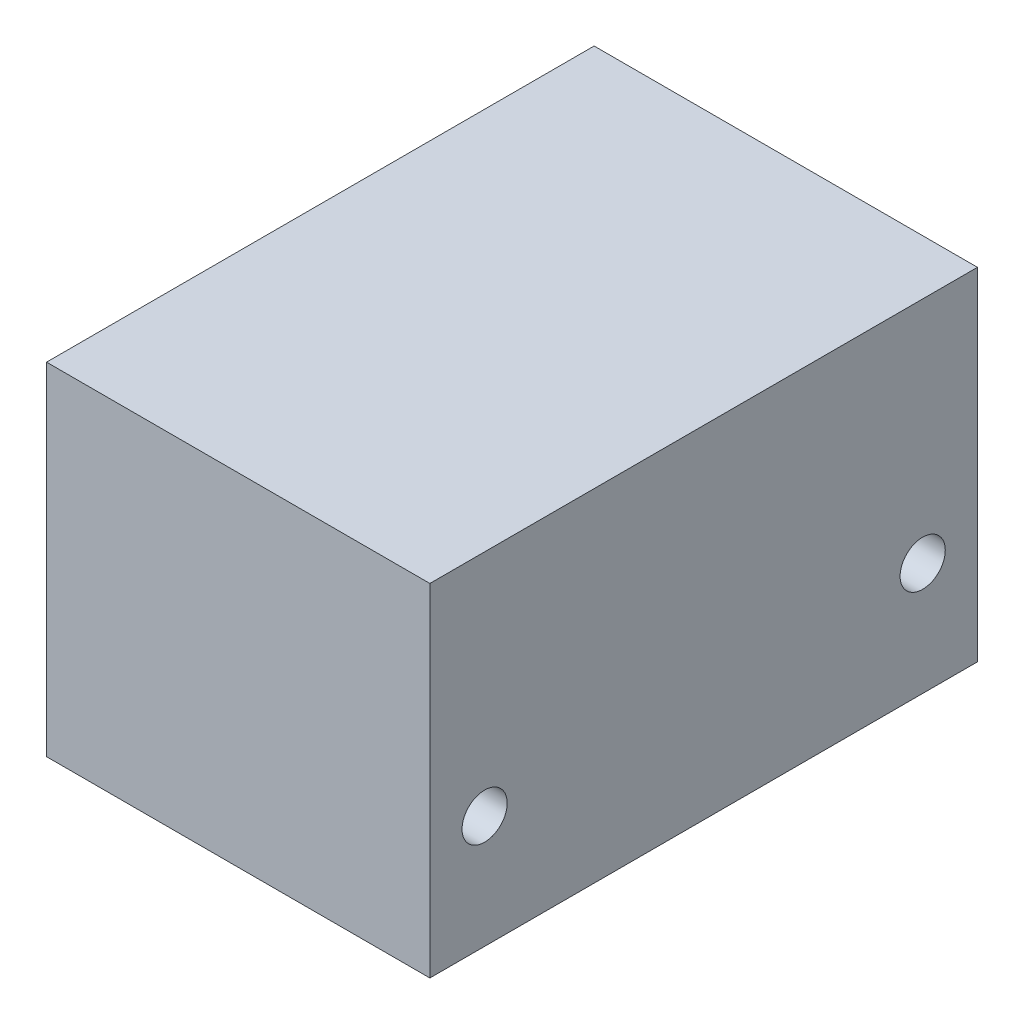
ISO-10303-21;
HEADER;
FILE_DESCRIPTION(('STEP AP214'),'2;1');
FILE_NAME('part.step','',(''),(''),'','','');
FILE_SCHEMA(('AUTOMOTIVE_DESIGN { 1 0 10303 214 1 1 1 1 }'));
ENDSEC;
DATA;
#1=APPLICATION_CONTEXT('core data for automotive mechanical design processes');
#2=APPLICATION_PROTOCOL_DEFINITION('international standard','automotive_design',2000,#1);
#3=PRODUCT_CONTEXT('',#1,'mechanical');
#4=PRODUCT('Part','Part','',(#3));
#5=PRODUCT_RELATED_PRODUCT_CATEGORY('part','',(#4));
#6=PRODUCT_DEFINITION_FORMATION('','',#4);
#7=PRODUCT_DEFINITION_CONTEXT('part definition',#1,'design');
#8=PRODUCT_DEFINITION('design','',#6,#7);
#9=PRODUCT_DEFINITION_SHAPE('','',#8);
#10=(LENGTH_UNIT() NAMED_UNIT(*) SI_UNIT(.MILLI.,.METRE.));
#11=(NAMED_UNIT(*) PLANE_ANGLE_UNIT() SI_UNIT($,.RADIAN.));
#12=(NAMED_UNIT(*) SI_UNIT($,.STERADIAN.) SOLID_ANGLE_UNIT());
#13=UNCERTAINTY_MEASURE_WITH_UNIT(LENGTH_MEASURE(1.E-05),#10,'distance_accuracy_value','');
#14=(GEOMETRIC_REPRESENTATION_CONTEXT(3) GLOBAL_UNCERTAINTY_ASSIGNED_CONTEXT((#13)) GLOBAL_UNIT_ASSIGNED_CONTEXT((#10,
#11,#12)) REPRESENTATION_CONTEXT('',''));
#15=CARTESIAN_POINT('',(0.,0.,0.));
#16=DIRECTION('',(0.,0.,1.));
#17=DIRECTION('',(1.,0.,0.));
#18=AXIS2_PLACEMENT_3D('',#15,#16,#17);
#19=CARTESIAN_POINT('',(-7.,13.98,10.));
#20=DIRECTION('',(1.,0.,0.));
#21=DIRECTION('',(0.,0.,-1.));
#22=AXIS2_PLACEMENT_3D('',#19,#20,#21);
#23=PLANE('',#22);
#24=CARTESIAN_POINT('',(-7.,5.62,8.));
#25=DIRECTION('',(1.,0.,0.));
#26=DIRECTION('',(0.,0.,-1.));
#27=AXIS2_PLACEMENT_3D('',#24,#25,#26);
#28=CIRCLE('',#27,0.825);
#29=CARTESIAN_POINT('',(-7.,5.62,7.175));
#30=VERTEX_POINT('',#29);
#31=EDGE_CURVE('E113',#30,#30,#28,.T.);
#32=ORIENTED_EDGE('',*,*,#31,.T.);
#33=EDGE_LOOP('',(#32));
#34=FACE_BOUND('',#33,.T.);
#35=CARTESIAN_POINT('',(-7.,5.62000000000001,-8.));
#36=DIRECTION('',(1.,0.,0.));
#37=DIRECTION('',(0.,0.,-1.));
#38=AXIS2_PLACEMENT_3D('',#35,#36,#37);
#39=CIRCLE('',#38,0.825);
#40=CARTESIAN_POINT('',(-7.,5.62000000000001,-8.825));
#41=VERTEX_POINT('',#40);
#42=EDGE_CURVE('E111',#41,#41,#39,.T.);
#43=ORIENTED_EDGE('',*,*,#42,.T.);
#44=EDGE_LOOP('',(#43));
#45=FACE_BOUND('',#44,.T.);
#46=DIRECTION('',(0.,0.,-1.));
#47=VECTOR('',#46,1.);
#48=CARTESIAN_POINT('',(-7.,1.5,10.));
#49=LINE('',#48,#47);
#50=CARTESIAN_POINT('',(-7.,1.5,10.));
#51=VERTEX_POINT('',#50);
#52=CARTESIAN_POINT('',(-7.,1.5,-10.));
#53=VERTEX_POINT('',#52);
#54=EDGE_CURVE('E56',#51,#53,#49,.T.);
#55=ORIENTED_EDGE('',*,*,#54,.F.);
#56=DIRECTION('',(0.,-1.,0.));
#57=VECTOR('',#56,1.);
#58=CARTESIAN_POINT('',(-7.,13.98,10.));
#59=LINE('',#58,#57);
#60=CARTESIAN_POINT('',(-7.,13.98,10.));
#61=VERTEX_POINT('',#60);
#62=EDGE_CURVE('E50',#61,#51,#59,.T.);
#63=ORIENTED_EDGE('',*,*,#62,.F.);
#64=DIRECTION('',(0.,0.,1.));
#65=VECTOR('',#64,1.);
#66=CARTESIAN_POINT('',(-7.,13.98,10.));
#67=LINE('',#66,#65);
#68=CARTESIAN_POINT('',(-7.,13.98,-10.));
#69=VERTEX_POINT('',#68);
#70=EDGE_CURVE('E115',#69,#61,#67,.T.);
#71=ORIENTED_EDGE('',*,*,#70,.F.);
#72=DIRECTION('',(0.,-1.,0.));
#73=VECTOR('',#72,1.);
#74=CARTESIAN_POINT('',(-7.,13.98,-10.));
#75=LINE('',#74,#73);
#76=EDGE_CURVE('E103',#69,#53,#75,.T.);
#77=ORIENTED_EDGE('',*,*,#76,.T.);
#78=EDGE_LOOP('',(#55,#63,#71,#77));
#79=FACE_BOUND('',#78,.T.);
#80=ADVANCED_FACE('F42',(#34,#45,#79),#23,.F.);
#81=CARTESIAN_POINT('',(7.,13.98,10.));
#82=DIRECTION('',(0.,0.,-1.));
#83=DIRECTION('',(-1.,0.,0.));
#84=AXIS2_PLACEMENT_3D('',#81,#82,#83);
#85=PLANE('',#84);
#86=DIRECTION('',(-1.,0.,0.));
#87=VECTOR('',#86,1.);
#88=CARTESIAN_POINT('',(-7.,1.5,10.));
#89=LINE('',#88,#87);
#90=CARTESIAN_POINT('',(7.,1.5,10.));
#91=VERTEX_POINT('',#90);
#92=EDGE_CURVE('E99',#91,#51,#89,.T.);
#93=ORIENTED_EDGE('',*,*,#92,.F.);
#94=DIRECTION('',(0.,-1.,0.));
#95=VECTOR('',#94,1.);
#96=CARTESIAN_POINT('',(7.,13.98,10.));
#97=LINE('',#96,#95);
#98=CARTESIAN_POINT('',(7.,13.98,10.));
#99=VERTEX_POINT('',#98);
#100=EDGE_CURVE('E97',#99,#91,#97,.T.);
#101=ORIENTED_EDGE('',*,*,#100,.F.);
#102=DIRECTION('',(1.,0.,0.));
#103=VECTOR('',#102,1.);
#104=CARTESIAN_POINT('',(7.,13.98,10.));
#105=LINE('',#104,#103);
#106=EDGE_CURVE('E109',#61,#99,#105,.T.);
#107=ORIENTED_EDGE('',*,*,#106,.F.);
#108=ORIENTED_EDGE('',*,*,#62,.T.);
#109=EDGE_LOOP('',(#93,#101,#107,#108));
#110=FACE_BOUND('',#109,.T.);
#111=ADVANCED_FACE('F151',(#110),#85,.F.);
#112=CARTESIAN_POINT('',(7.,13.98,10.));
#113=DIRECTION('',(-1.,0.,0.));
#114=DIRECTION('',(0.,0.,1.));
#115=AXIS2_PLACEMENT_3D('',#112,#113,#114);
#116=PLANE('',#115);
#117=CARTESIAN_POINT('',(7.,5.62,8.));
#118=DIRECTION('',(1.,0.,0.));
#119=DIRECTION('',(0.,0.,-1.));
#120=AXIS2_PLACEMENT_3D('',#117,#118,#119);
#121=CIRCLE('',#120,0.825);
#122=CARTESIAN_POINT('',(7.,5.62,7.175));
#123=VERTEX_POINT('',#122);
#124=EDGE_CURVE('E119',#123,#123,#121,.T.);
#125=ORIENTED_EDGE('',*,*,#124,.F.);
#126=EDGE_LOOP('',(#125));
#127=FACE_BOUND('',#126,.T.);
#128=CARTESIAN_POINT('',(7.,5.62000000000001,-8.));
#129=DIRECTION('',(1.,0.,0.));
#130=DIRECTION('',(0.,0.,-1.));
#131=AXIS2_PLACEMENT_3D('',#128,#129,#130);
#132=CIRCLE('',#131,0.825);
#133=CARTESIAN_POINT('',(7.,5.62000000000001,-8.825));
#134=VERTEX_POINT('',#133);
#135=EDGE_CURVE('E121',#134,#134,#132,.T.);
#136=ORIENTED_EDGE('',*,*,#135,.F.);
#137=EDGE_LOOP('',(#136));
#138=FACE_BOUND('',#137,.T.);
#139=DIRECTION('',(0.,0.,1.));
#140=VECTOR('',#139,1.);
#141=CARTESIAN_POINT('',(7.,1.5,10.));
#142=LINE('',#141,#140);
#143=CARTESIAN_POINT('',(7.,1.5,-10.));
#144=VERTEX_POINT('',#143);
#145=EDGE_CURVE('E88',#144,#91,#142,.T.);
#146=ORIENTED_EDGE('',*,*,#145,.F.);
#147=DIRECTION('',(0.,-1.,0.));
#148=VECTOR('',#147,1.);
#149=CARTESIAN_POINT('',(7.,13.98,-10.));
#150=LINE('',#149,#148);
#151=CARTESIAN_POINT('',(7.,13.98,-10.));
#152=VERTEX_POINT('',#151);
#153=EDGE_CURVE('E100',#152,#144,#150,.T.);
#154=ORIENTED_EDGE('',*,*,#153,.F.);
#155=DIRECTION('',(0.,0.,-1.));
#156=VECTOR('',#155,1.);
#157=CARTESIAN_POINT('',(7.,13.98,10.));
#158=LINE('',#157,#156);
#159=EDGE_CURVE('E107',#99,#152,#158,.T.);
#160=ORIENTED_EDGE('',*,*,#159,.F.);
#161=ORIENTED_EDGE('',*,*,#100,.T.);
#162=EDGE_LOOP('',(#146,#154,#160,#161));
#163=FACE_BOUND('',#162,.T.);
#164=ADVANCED_FACE('F92',(#127,#138,#163),#116,.F.);
#165=CARTESIAN_POINT('',(7.,13.98,-10.));
#166=DIRECTION('',(0.,0.,1.));
#167=DIRECTION('',(1.,0.,0.));
#168=AXIS2_PLACEMENT_3D('',#165,#166,#167);
#169=PLANE('',#168);
#170=DIRECTION('',(1.,0.,0.));
#171=VECTOR('',#170,1.);
#172=CARTESIAN_POINT('',(-7.,1.5,-10.));
#173=LINE('',#172,#171);
#174=EDGE_CURVE('E84',#53,#144,#173,.T.);
#175=ORIENTED_EDGE('',*,*,#174,.F.);
#176=ORIENTED_EDGE('',*,*,#76,.F.);
#177=DIRECTION('',(-1.,0.,0.));
#178=VECTOR('',#177,1.);
#179=CARTESIAN_POINT('',(7.,13.98,-10.));
#180=LINE('',#179,#178);
#181=EDGE_CURVE('E67',#152,#69,#180,.T.);
#182=ORIENTED_EDGE('',*,*,#181,.F.);
#183=ORIENTED_EDGE('',*,*,#153,.T.);
#184=EDGE_LOOP('',(#175,#176,#182,#183));
#185=FACE_BOUND('',#184,.T.);
#186=ADVANCED_FACE('F105',(#185),#169,.F.);
#187=CARTESIAN_POINT('',(0.,13.98,0.));
#188=DIRECTION('',(0.,1.,0.));
#189=DIRECTION('',(0.,0.,1.));
#190=AXIS2_PLACEMENT_3D('',#187,#188,#189);
#191=PLANE('',#190);
#192=ORIENTED_EDGE('',*,*,#70,.T.);
#193=ORIENTED_EDGE('',*,*,#106,.T.);
#194=ORIENTED_EDGE('',*,*,#159,.T.);
#195=ORIENTED_EDGE('',*,*,#181,.T.);
#196=EDGE_LOOP('',(#192,#193,#194,#195));
#197=FACE_BOUND('',#196,.T.);
#198=ADVANCED_FACE('F163',(#197),#191,.T.);
#199=CARTESIAN_POINT('',(-7.,5.62,8.));
#200=DIRECTION('',(1.,0.,0.));
#201=DIRECTION('',(0.,0.,-1.));
#202=AXIS2_PLACEMENT_3D('',#199,#200,#201);
#203=CYLINDRICAL_SURFACE('',#202,0.825);
#204=CARTESIAN_POINT('',(-7.,5.62,7.175));
#205=CARTESIAN_POINT('',(-6.85416666666667,5.62,7.175));
#206=CARTESIAN_POINT('',(-6.70833333333333,5.62,7.175));
#207=CARTESIAN_POINT('',(-6.41666666666667,5.62,7.175));
#208=CARTESIAN_POINT('',(-6.27083333333333,5.62,7.175));
#209=CARTESIAN_POINT('',(-5.97916666666667,5.62,7.175));
#210=CARTESIAN_POINT('',(-5.83333333333334,5.62,7.175));
#211=CARTESIAN_POINT('',(-5.54166666666667,5.62,7.175));
#212=CARTESIAN_POINT('',(-5.39583333333333,5.62,7.175));
#213=CARTESIAN_POINT('',(-5.10416666666667,5.62,7.175));
#214=CARTESIAN_POINT('',(-4.95833333333334,5.62,7.175));
#215=CARTESIAN_POINT('',(-4.66666666666667,5.62,7.175));
#216=CARTESIAN_POINT('',(-4.52083333333334,5.62,7.175));
#217=CARTESIAN_POINT('',(-4.22916666666667,5.62,7.175));
#218=CARTESIAN_POINT('',(-4.08333333333334,5.62,7.175));
#219=CARTESIAN_POINT('',(-3.79166666666667,5.62,7.175));
#220=CARTESIAN_POINT('',(-3.64583333333334,5.62,7.175));
#221=CARTESIAN_POINT('',(-3.35416666666667,5.62,7.175));
#222=CARTESIAN_POINT('',(-3.20833333333334,5.62,7.175));
#223=CARTESIAN_POINT('',(-2.91666666666667,5.62,7.175));
#224=CARTESIAN_POINT('',(-2.77083333333334,5.62,7.175));
#225=CARTESIAN_POINT('',(-2.47916666666667,5.62,7.175));
#226=CARTESIAN_POINT('',(-2.33333333333334,5.62,7.175));
#227=CARTESIAN_POINT('',(-2.04166666666667,5.62,7.175));
#228=CARTESIAN_POINT('',(-1.89583333333334,5.62,7.175));
#229=CARTESIAN_POINT('',(-1.60416666666667,5.62,7.175));
#230=CARTESIAN_POINT('',(-1.45833333333334,5.62,7.175));
#231=CARTESIAN_POINT('',(-1.16666666666667,5.62,7.175));
#232=CARTESIAN_POINT('',(-1.02083333333334,5.62,7.175));
#233=CARTESIAN_POINT('',(-0.729166666666669,5.62,7.175));
#234=CARTESIAN_POINT('',(-0.583333333333336,5.62,7.175));
#235=CARTESIAN_POINT('',(-0.29166666666667,5.62,7.175));
#236=CARTESIAN_POINT('',(-0.145833333333336,5.62,7.175));
#237=CARTESIAN_POINT('',(0.145833333333331,5.62,7.175));
#238=CARTESIAN_POINT('',(0.291666666666664,5.62,7.175));
#239=CARTESIAN_POINT('',(0.583333333333331,5.62,7.175));
#240=CARTESIAN_POINT('',(0.729166666666664,5.62,7.175));
#241=CARTESIAN_POINT('',(1.02083333333333,5.62,7.175));
#242=CARTESIAN_POINT('',(1.16666666666666,5.62,7.175));
#243=CARTESIAN_POINT('',(1.45833333333333,5.62,7.175));
#244=CARTESIAN_POINT('',(1.60416666666666,5.62,7.175));
#245=CARTESIAN_POINT('',(1.89583333333333,5.62,7.175));
#246=CARTESIAN_POINT('',(2.04166666666666,5.62,7.175));
#247=CARTESIAN_POINT('',(2.33333333333333,5.62,7.175));
#248=CARTESIAN_POINT('',(2.47916666666666,5.62,7.175));
#249=CARTESIAN_POINT('',(2.77083333333333,5.62,7.175));
#250=CARTESIAN_POINT('',(2.91666666666666,5.62,7.175));
#251=CARTESIAN_POINT('',(3.20833333333333,5.62,7.175));
#252=CARTESIAN_POINT('',(3.35416666666666,5.62,7.175));
#253=CARTESIAN_POINT('',(3.64583333333333,5.62,7.175));
#254=CARTESIAN_POINT('',(3.79166666666666,5.62,7.175));
#255=CARTESIAN_POINT('',(4.08333333333333,5.62,7.175));
#256=CARTESIAN_POINT('',(4.22916666666666,5.62,7.175));
#257=CARTESIAN_POINT('',(4.52083333333333,5.62,7.175));
#258=CARTESIAN_POINT('',(4.66666666666666,5.62,7.175));
#259=CARTESIAN_POINT('',(4.95833333333333,5.62,7.175));
#260=CARTESIAN_POINT('',(5.10416666666666,5.62,7.175));
#261=CARTESIAN_POINT('',(5.39583333333333,5.62,7.175));
#262=CARTESIAN_POINT('',(5.54166666666666,5.62,7.175));
#263=CARTESIAN_POINT('',(5.83333333333333,5.62,7.175));
#264=CARTESIAN_POINT('',(5.97916666666666,5.62,7.175));
#265=CARTESIAN_POINT('',(6.27083333333333,5.62,7.175));
#266=CARTESIAN_POINT('',(6.41666666666666,5.62,7.175));
#267=CARTESIAN_POINT('',(6.70833333333333,5.62,7.175));
#268=CARTESIAN_POINT('',(6.85416666666666,5.62,7.175));
#269=CARTESIAN_POINT('',(7.,5.62,7.175));
#270=B_SPLINE_CURVE_WITH_KNOTS('',3,(#204,#205,#206,#207,#208,#209,#210,#211,#212,#213,#214,
#215,#216,#217,#218,#219,#220,#221,#222,#223,#224,#225,#226,#227,#228,#229,#230,#231,#232,#233,
#234,#235,#236,#237,#238,#239,#240,#241,#242,#243,#244,#245,#246,#247,#248,#249,#250,#251,#252,
#253,#254,#255,#256,#257,#258,#259,#260,#261,#262,#263,#264,#265,#266,#267,#268,#269),
.UNSPECIFIED.,.F.,.F.,(4,2,2,2,2,2,2,2,2,2,2,2,2,2,2,2,2,2,2,2,2,2,2,2,2,2,2,2,2,2,2,2,4),(0.,
0.4375,0.874999999999999,1.3125,1.75,2.1875,2.625,3.0625,3.5,3.9375,4.375,4.8125,5.25,5.6875,
6.125,6.5625,7.,7.4375,7.875,8.3125,8.75,9.1875,9.625,10.0625,10.5,10.9375,11.375,11.8125,12.25,
12.6875,13.125,13.5625,14.),.UNSPECIFIED.);
#271=EDGE_CURVE('BSEAM150',#30,#123,#270,.T.);
#272=ORIENTED_EDGE('',*,*,#31,.F.);
#273=ORIENTED_EDGE('',*,*,#124,.T.);
#274=ORIENTED_EDGE('',*,*,#271,.T.);
#275=ORIENTED_EDGE('',*,*,#271,.F.);
#276=EDGE_LOOP('',(#272,#274,#273,#275));
#277=FACE_BOUND('',#276,.T.);
#278=ADVANCED_FACE('F150',(#277),#203,.F.);
#279=CARTESIAN_POINT('',(-7.,5.62000000000001,-8.));
#280=DIRECTION('',(1.,0.,0.));
#281=DIRECTION('',(0.,0.,-1.));
#282=AXIS2_PLACEMENT_3D('',#279,#280,#281);
#283=CYLINDRICAL_SURFACE('',#282,0.825);
#284=CARTESIAN_POINT('',(-7.,5.62000000000001,-8.825));
#285=CARTESIAN_POINT('',(-6.85416666666667,5.62000000000001,-8.825));
#286=CARTESIAN_POINT('',(-6.70833333333333,5.62000000000001,-8.825));
#287=CARTESIAN_POINT('',(-6.41666666666667,5.62000000000001,-8.825));
#288=CARTESIAN_POINT('',(-6.27083333333333,5.62000000000001,-8.825));
#289=CARTESIAN_POINT('',(-5.97916666666667,5.62000000000001,-8.825));
#290=CARTESIAN_POINT('',(-5.83333333333334,5.62000000000001,-8.825));
#291=CARTESIAN_POINT('',(-5.54166666666667,5.62000000000001,-8.825));
#292=CARTESIAN_POINT('',(-5.39583333333333,5.62000000000001,-8.825));
#293=CARTESIAN_POINT('',(-5.10416666666667,5.62000000000001,-8.825));
#294=CARTESIAN_POINT('',(-4.95833333333334,5.62000000000001,-8.825));
#295=CARTESIAN_POINT('',(-4.66666666666667,5.62000000000001,-8.825));
#296=CARTESIAN_POINT('',(-4.52083333333334,5.62000000000001,-8.825));
#297=CARTESIAN_POINT('',(-4.22916666666667,5.62000000000001,-8.825));
#298=CARTESIAN_POINT('',(-4.08333333333334,5.62000000000001,-8.825));
#299=CARTESIAN_POINT('',(-3.79166666666667,5.62000000000001,-8.825));
#300=CARTESIAN_POINT('',(-3.64583333333334,5.62000000000001,-8.825));
#301=CARTESIAN_POINT('',(-3.35416666666667,5.62000000000001,-8.825));
#302=CARTESIAN_POINT('',(-3.20833333333334,5.62000000000001,-8.825));
#303=CARTESIAN_POINT('',(-2.91666666666667,5.62000000000001,-8.825));
#304=CARTESIAN_POINT('',(-2.77083333333334,5.62000000000001,-8.825));
#305=CARTESIAN_POINT('',(-2.47916666666667,5.62000000000001,-8.825));
#306=CARTESIAN_POINT('',(-2.33333333333334,5.62000000000001,-8.825));
#307=CARTESIAN_POINT('',(-2.04166666666667,5.62000000000001,-8.825));
#308=CARTESIAN_POINT('',(-1.89583333333334,5.62000000000001,-8.825));
#309=CARTESIAN_POINT('',(-1.60416666666667,5.62000000000001,-8.825));
#310=CARTESIAN_POINT('',(-1.45833333333334,5.62000000000001,-8.825));
#311=CARTESIAN_POINT('',(-1.16666666666667,5.62000000000001,-8.825));
#312=CARTESIAN_POINT('',(-1.02083333333334,5.62000000000001,-8.825));
#313=CARTESIAN_POINT('',(-0.729166666666669,5.62000000000001,-8.825));
#314=CARTESIAN_POINT('',(-0.583333333333336,5.62000000000001,-8.825));
#315=CARTESIAN_POINT('',(-0.29166666666667,5.62000000000001,-8.825));
#316=CARTESIAN_POINT('',(-0.145833333333336,5.62000000000001,-8.825));
#317=CARTESIAN_POINT('',(0.145833333333331,5.62000000000001,-8.825));
#318=CARTESIAN_POINT('',(0.291666666666664,5.62000000000001,-8.825));
#319=CARTESIAN_POINT('',(0.583333333333331,5.62000000000001,-8.825));
#320=CARTESIAN_POINT('',(0.729166666666664,5.62000000000001,-8.825));
#321=CARTESIAN_POINT('',(1.02083333333333,5.62000000000001,-8.825));
#322=CARTESIAN_POINT('',(1.16666666666666,5.62000000000001,-8.825));
#323=CARTESIAN_POINT('',(1.45833333333333,5.62000000000001,-8.825));
#324=CARTESIAN_POINT('',(1.60416666666666,5.62000000000001,-8.825));
#325=CARTESIAN_POINT('',(1.89583333333333,5.62000000000001,-8.825));
#326=CARTESIAN_POINT('',(2.04166666666666,5.62000000000001,-8.825));
#327=CARTESIAN_POINT('',(2.33333333333333,5.62000000000001,-8.825));
#328=CARTESIAN_POINT('',(2.47916666666666,5.62000000000001,-8.825));
#329=CARTESIAN_POINT('',(2.77083333333333,5.62000000000001,-8.825));
#330=CARTESIAN_POINT('',(2.91666666666666,5.62000000000001,-8.825));
#331=CARTESIAN_POINT('',(3.20833333333333,5.62000000000001,-8.825));
#332=CARTESIAN_POINT('',(3.35416666666666,5.62000000000001,-8.825));
#333=CARTESIAN_POINT('',(3.64583333333333,5.62000000000001,-8.825));
#334=CARTESIAN_POINT('',(3.79166666666666,5.62000000000001,-8.825));
#335=CARTESIAN_POINT('',(4.08333333333333,5.62000000000001,-8.825));
#336=CARTESIAN_POINT('',(4.22916666666666,5.62000000000001,-8.825));
#337=CARTESIAN_POINT('',(4.52083333333333,5.62000000000001,-8.825));
#338=CARTESIAN_POINT('',(4.66666666666666,5.62000000000001,-8.825));
#339=CARTESIAN_POINT('',(4.95833333333333,5.62000000000001,-8.825));
#340=CARTESIAN_POINT('',(5.10416666666666,5.62000000000001,-8.825));
#341=CARTESIAN_POINT('',(5.39583333333333,5.62000000000001,-8.825));
#342=CARTESIAN_POINT('',(5.54166666666666,5.62000000000001,-8.825));
#343=CARTESIAN_POINT('',(5.83333333333333,5.62000000000001,-8.825));
#344=CARTESIAN_POINT('',(5.97916666666666,5.62000000000001,-8.825));
#345=CARTESIAN_POINT('',(6.27083333333333,5.62000000000001,-8.825));
#346=CARTESIAN_POINT('',(6.41666666666666,5.62000000000001,-8.825));
#347=CARTESIAN_POINT('',(6.70833333333333,5.62000000000001,-8.825));
#348=CARTESIAN_POINT('',(6.85416666666666,5.62000000000001,-8.825));
#349=CARTESIAN_POINT('',(7.,5.62000000000001,-8.825));
#350=B_SPLINE_CURVE_WITH_KNOTS('',3,(#284,#285,#286,#287,#288,#289,#290,#291,#292,#293,#294,
#295,#296,#297,#298,#299,#300,#301,#302,#303,#304,#305,#306,#307,#308,#309,#310,#311,#312,#313,
#314,#315,#316,#317,#318,#319,#320,#321,#322,#323,#324,#325,#326,#327,#328,#329,#330,#331,#332,
#333,#334,#335,#336,#337,#338,#339,#340,#341,#342,#343,#344,#345,#346,#347,#348,#349),
.UNSPECIFIED.,.F.,.F.,(4,2,2,2,2,2,2,2,2,2,2,2,2,2,2,2,2,2,2,2,2,2,2,2,2,2,2,2,2,2,2,2,4),(0.,
0.4375,0.874999999999999,1.3125,1.75,2.1875,2.625,3.0625,3.5,3.9375,4.375,4.8125,5.25,5.6875,
6.125,6.5625,7.,7.4375,7.875,8.3125,8.75,9.1875,9.625,10.0625,10.5,10.9375,11.375,11.8125,12.25,
12.6875,13.125,13.5625,14.),.UNSPECIFIED.);
#351=EDGE_CURVE('BSEAM143',#41,#134,#350,.T.);
#352=ORIENTED_EDGE('',*,*,#42,.F.);
#353=ORIENTED_EDGE('',*,*,#135,.T.);
#354=ORIENTED_EDGE('',*,*,#351,.T.);
#355=ORIENTED_EDGE('',*,*,#351,.F.);
#356=EDGE_LOOP('',(#352,#354,#353,#355));
#357=FACE_BOUND('',#356,.T.);
#358=ADVANCED_FACE('F143',(#357),#283,.F.);
#359=CARTESIAN_POINT('',(0.,1.5,0.));
#360=DIRECTION('',(0.,-1.,0.));
#361=DIRECTION('',(0.,0.,-1.));
#362=AXIS2_PLACEMENT_3D('',#359,#360,#361);
#363=PLANE('',#362);
#364=CARTESIAN_POINT('',(0.,1.5,0.));
#365=DIRECTION('',(0.,-1.,0.));
#366=DIRECTION('',(0.,0.,-1.));
#367=AXIS2_PLACEMENT_3D('',#364,#365,#366);
#368=CIRCLE('',#367,4.55);
#369=CARTESIAN_POINT('',(0.,1.5,-4.55));
#370=VERTEX_POINT('',#369);
#371=EDGE_CURVE('E11',#370,#370,#368,.T.);
#372=ORIENTED_EDGE('',*,*,#371,.F.);
#373=EDGE_LOOP('',(#372));
#374=FACE_BOUND('',#373,.T.);
#375=ORIENTED_EDGE('',*,*,#54,.T.);
#376=ORIENTED_EDGE('',*,*,#174,.T.);
#377=ORIENTED_EDGE('',*,*,#145,.T.);
#378=ORIENTED_EDGE('',*,*,#92,.T.);
#379=EDGE_LOOP('',(#375,#376,#377,#378));
#380=FACE_BOUND('',#379,.T.);
#381=ADVANCED_FACE('F85',(#374,#380),#363,.T.);
#382=CARTESIAN_POINT('',(0.,0.,0.));
#383=DIRECTION('',(0.,1.,0.));
#384=DIRECTION('',(0.,0.,1.));
#385=AXIS2_PLACEMENT_3D('',#382,#383,#384);
#386=CYLINDRICAL_SURFACE('',#385,4.55);
#387=CARTESIAN_POINT('',(0.,0.,0.));
#388=DIRECTION('',(0.,-1.,0.));
#389=DIRECTION('',(0.,0.,-1.));
#390=AXIS2_PLACEMENT_3D('',#387,#388,#389);
#391=CIRCLE('',#390,4.55);
#392=CARTESIAN_POINT('',(0.,0.,-4.55));
#393=VERTEX_POINT('',#392);
#394=EDGE_CURVE('E130',#393,#393,#391,.T.);
#395=ORIENTED_EDGE('',*,*,#394,.F.);
#396=EDGE_LOOP('',(#395));
#397=FACE_BOUND('',#396,.T.);
#398=ORIENTED_EDGE('',*,*,#371,.T.);
#399=EDGE_LOOP('',(#398));
#400=FACE_BOUND('',#399,.T.);
#401=ADVANCED_FACE('F131',(#397,#400),#386,.T.);
#402=CARTESIAN_POINT('',(0.,0.,0.));
#403=DIRECTION('',(0.,-1.,0.));
#404=DIRECTION('',(0.,0.,-1.));
#405=AXIS2_PLACEMENT_3D('',#402,#403,#404);
#406=PLANE('',#405);
#407=ORIENTED_EDGE('',*,*,#394,.T.);
#408=EDGE_LOOP('',(#407));
#409=FACE_BOUND('',#408,.T.);
#410=ADVANCED_FACE('F135',(#409),#406,.T.);
#411=CLOSED_SHELL('',(#80,#111,#164,#186,#198,#278,#358,#381,#401,#410));
#412=MANIFOLD_SOLID_BREP('B2',#411);
#413=ADVANCED_BREP_SHAPE_REPRESENTATION('',(#18,#412),#14);
#414=SHAPE_DEFINITION_REPRESENTATION(#9,#413);
ENDSEC;
END-ISO-10303-21;
